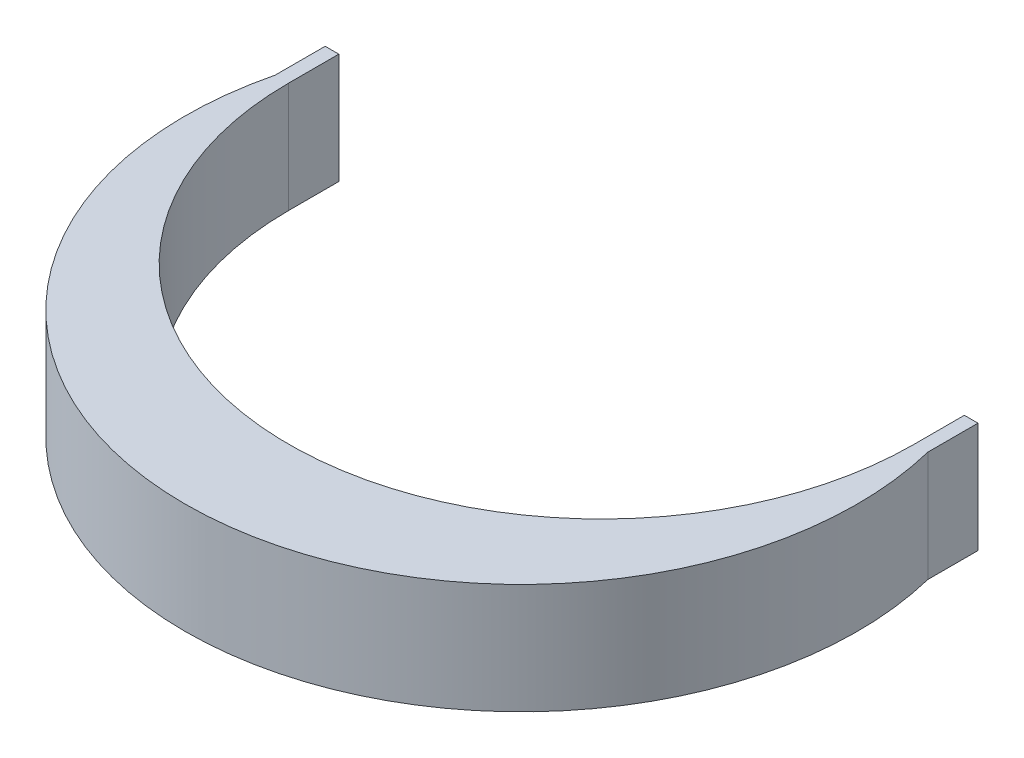
ISO-10303-21;
HEADER;
FILE_DESCRIPTION(('STEP AP214'),'2;1');
FILE_NAME('part.step','',(''),(''),'','','');
FILE_SCHEMA(('AUTOMOTIVE_DESIGN { 1 0 10303 214 1 1 1 1 }'));
ENDSEC;
DATA;
#1=APPLICATION_CONTEXT('core data for automotive mechanical design processes');
#2=APPLICATION_PROTOCOL_DEFINITION('international standard','automotive_design',2000,#1);
#3=PRODUCT_CONTEXT('',#1,'mechanical');
#4=PRODUCT('Part','Part','',(#3));
#5=PRODUCT_RELATED_PRODUCT_CATEGORY('part','',(#4));
#6=PRODUCT_DEFINITION_FORMATION('','',#4);
#7=PRODUCT_DEFINITION_CONTEXT('part definition',#1,'design');
#8=PRODUCT_DEFINITION('design','',#6,#7);
#9=PRODUCT_DEFINITION_SHAPE('','',#8);
#10=(LENGTH_UNIT() NAMED_UNIT(*) SI_UNIT(.MILLI.,.METRE.));
#11=(NAMED_UNIT(*) PLANE_ANGLE_UNIT() SI_UNIT($,.RADIAN.));
#12=(NAMED_UNIT(*) SI_UNIT($,.STERADIAN.) SOLID_ANGLE_UNIT());
#13=UNCERTAINTY_MEASURE_WITH_UNIT(LENGTH_MEASURE(1.E-05),#10,'distance_accuracy_value','');
#14=(GEOMETRIC_REPRESENTATION_CONTEXT(3) GLOBAL_UNCERTAINTY_ASSIGNED_CONTEXT((#13)) GLOBAL_UNIT_ASSIGNED_CONTEXT((#10,
#11,#12)) REPRESENTATION_CONTEXT('',''));
#15=CARTESIAN_POINT('',(0.,0.,0.));
#16=DIRECTION('',(0.,0.,1.));
#17=DIRECTION('',(1.,0.,0.));
#18=AXIS2_PLACEMENT_3D('',#15,#16,#17);
#19=CARTESIAN_POINT('',(0.,0.,1.25));
#20=DIRECTION('',(-1.,0.,0.));
#21=DIRECTION('',(0.,0.,1.));
#22=AXIS2_PLACEMENT_3D('',#19,#20,#21);
#23=PLANE('',#22);
#24=DIRECTION('',(0.,1.,0.));
#25=VECTOR('',#24,1.);
#26=CARTESIAN_POINT('',(0.,0.,0.));
#27=LINE('',#26,#25);
#28=CARTESIAN_POINT('',(0.,0.,0.));
#29=VERTEX_POINT('',#28);
#30=CARTESIAN_POINT('',(0.,2.75,0.));
#31=VERTEX_POINT('',#30);
#32=EDGE_CURVE('E168',#29,#31,#27,.T.);
#33=ORIENTED_EDGE('',*,*,#32,.T.);
#34=DIRECTION('',(0.,0.,-1.));
#35=VECTOR('',#34,1.);
#36=CARTESIAN_POINT('',(0.,2.75,1.25));
#37=LINE('',#36,#35);
#38=CARTESIAN_POINT('',(0.,2.75,1.25));
#39=VERTEX_POINT('',#38);
#40=EDGE_CURVE('E11',#39,#31,#37,.T.);
#41=ORIENTED_EDGE('',*,*,#40,.F.);
#42=DIRECTION('',(0.,1.,0.));
#43=VECTOR('',#42,1.);
#44=CARTESIAN_POINT('',(0.,0.,1.25));
#45=LINE('',#44,#43);
#46=CARTESIAN_POINT('',(0.,0.,1.25));
#47=VERTEX_POINT('',#46);
#48=EDGE_CURVE('E178',#47,#39,#45,.T.);
#49=ORIENTED_EDGE('',*,*,#48,.F.);
#50=DIRECTION('',(0.,0.,-1.));
#51=VECTOR('',#50,1.);
#52=CARTESIAN_POINT('',(0.,0.,1.25));
#53=LINE('',#52,#51);
#54=EDGE_CURVE('E185',#47,#29,#53,.T.);
#55=ORIENTED_EDGE('',*,*,#54,.T.);
#56=EDGE_LOOP('',(#33,#41,#49,#55));
#57=FACE_BOUND('',#56,.T.);
#58=ADVANCED_FACE('F51',(#57),#23,.F.);
#59=CARTESIAN_POINT('',(0.,2.75,1.25));
#60=DIRECTION('',(0.,-1.,0.));
#61=DIRECTION('',(0.,0.,-1.));
#62=AXIS2_PLACEMENT_3D('',#59,#60,#61);
#63=PLANE('',#62);
#64=DIRECTION('',(-1.,0.,0.));
#65=VECTOR('',#64,1.);
#66=CARTESIAN_POINT('',(0.,2.75,0.));
#67=LINE('',#66,#65);
#68=CARTESIAN_POINT('',(-0.34,2.75,0.));
#69=VERTEX_POINT('',#68);
#70=EDGE_CURVE('E188',#31,#69,#67,.T.);
#71=ORIENTED_EDGE('',*,*,#70,.T.);
#72=DIRECTION('',(0.,0.,-1.));
#73=VECTOR('',#72,1.);
#74=CARTESIAN_POINT('',(-0.34,2.75,1.25));
#75=LINE('',#74,#73);
#76=CARTESIAN_POINT('',(-0.34,2.75,1.25));
#77=VERTEX_POINT('',#76);
#78=EDGE_CURVE('E60',#77,#69,#75,.T.);
#79=ORIENTED_EDGE('',*,*,#78,.F.);
#80=CARTESIAN_POINT('',(7.795,2.75,3.25));
#81=DIRECTION('',(0.,1.,0.));
#82=DIRECTION('',(0.,0.,1.));
#83=AXIS2_PLACEMENT_3D('',#80,#81,#82);
#84=CIRCLE('',#83,8.37724443166427);
#85=CARTESIAN_POINT('',(15.929999955,2.75,1.25));
#86=VERTEX_POINT('',#85);
#87=EDGE_CURVE('E151',#77,#86,#84,.T.);
#88=ORIENTED_EDGE('',*,*,#87,.T.);
#89=DIRECTION('',(0.,0.,-1.));
#90=VECTOR('',#89,1.);
#91=CARTESIAN_POINT('',(15.929999955,2.75,1.25));
#92=LINE('',#91,#90);
#93=CARTESIAN_POINT('',(15.929999955,2.75,0.));
#94=VERTEX_POINT('',#93);
#95=EDGE_CURVE('E132',#86,#94,#92,.T.);
#96=ORIENTED_EDGE('',*,*,#95,.T.);
#97=DIRECTION('',(-1.,0.,0.));
#98=VECTOR('',#97,1.);
#99=CARTESIAN_POINT('',(15.59,2.75,0.));
#100=LINE('',#99,#98);
#101=CARTESIAN_POINT('',(15.59,2.75,0.));
#102=VERTEX_POINT('',#101);
#103=EDGE_CURVE('E125',#94,#102,#100,.T.);
#104=ORIENTED_EDGE('',*,*,#103,.T.);
#105=DIRECTION('',(0.,0.,-1.));
#106=VECTOR('',#105,1.);
#107=CARTESIAN_POINT('',(15.59,2.75,1.25));
#108=LINE('',#107,#106);
#109=CARTESIAN_POINT('',(15.59,2.75,1.25));
#110=VERTEX_POINT('',#109);
#111=EDGE_CURVE('E129',#110,#102,#108,.T.);
#112=ORIENTED_EDGE('',*,*,#111,.F.);
#113=CARTESIAN_POINT('',(7.795,2.75,1.25));
#114=DIRECTION('',(0.,-1.,0.));
#115=DIRECTION('',(0.,0.,1.));
#116=AXIS2_PLACEMENT_3D('',#113,#114,#115);
#117=CIRCLE('',#116,7.795);
#118=EDGE_CURVE('E157',#110,#39,#117,.T.);
#119=ORIENTED_EDGE('',*,*,#118,.T.);
#120=ORIENTED_EDGE('',*,*,#40,.T.);
#121=EDGE_LOOP('',(#71,#79,#88,#96,#104,#112,#119,#120));
#122=FACE_BOUND('',#121,.T.);
#123=ADVANCED_FACE('F127',(#122),#63,.F.);
#124=CARTESIAN_POINT('',(-0.34,0.,1.25));
#125=DIRECTION('',(1.,0.,0.));
#126=DIRECTION('',(0.,0.,-1.));
#127=AXIS2_PLACEMENT_3D('',#124,#125,#126);
#128=PLANE('',#127);
#129=DIRECTION('',(0.,-1.,0.));
#130=VECTOR('',#129,1.);
#131=CARTESIAN_POINT('',(-0.34,0.,0.));
#132=LINE('',#131,#130);
#133=CARTESIAN_POINT('',(-0.34,0.,0.));
#134=VERTEX_POINT('',#133);
#135=EDGE_CURVE('E84',#69,#134,#132,.T.);
#136=ORIENTED_EDGE('',*,*,#135,.T.);
#137=DIRECTION('',(0.,0.,-1.));
#138=VECTOR('',#137,1.);
#139=CARTESIAN_POINT('',(-0.34,0.,1.25));
#140=LINE('',#139,#138);
#141=CARTESIAN_POINT('',(-0.34,0.,1.25));
#142=VERTEX_POINT('',#141);
#143=EDGE_CURVE('E68',#142,#134,#140,.T.);
#144=ORIENTED_EDGE('',*,*,#143,.F.);
#145=DIRECTION('',(0.,-1.,0.));
#146=VECTOR('',#145,1.);
#147=CARTESIAN_POINT('',(-0.34,0.,1.25));
#148=LINE('',#147,#146);
#149=EDGE_CURVE('E181',#77,#142,#148,.T.);
#150=ORIENTED_EDGE('',*,*,#149,.F.);
#151=ORIENTED_EDGE('',*,*,#78,.T.);
#152=EDGE_LOOP('',(#136,#144,#150,#151));
#153=FACE_BOUND('',#152,.T.);
#154=ADVANCED_FACE('F201',(#153),#128,.F.);
#155=CARTESIAN_POINT('',(0.,0.,1.25));
#156=DIRECTION('',(0.,1.,0.));
#157=DIRECTION('',(-1.,0.,0.));
#158=AXIS2_PLACEMENT_3D('',#155,#156,#157);
#159=PLANE('',#158);
#160=DIRECTION('',(1.,0.,0.));
#161=VECTOR('',#160,1.);
#162=CARTESIAN_POINT('',(0.,0.,0.));
#163=LINE('',#162,#161);
#164=EDGE_CURVE('E89',#134,#29,#163,.T.);
#165=ORIENTED_EDGE('',*,*,#164,.T.);
#166=ORIENTED_EDGE('',*,*,#54,.F.);
#167=CARTESIAN_POINT('',(7.795,0.,1.25));
#168=DIRECTION('',(0.,1.,0.));
#169=DIRECTION('',(-1.,0.,0.));
#170=AXIS2_PLACEMENT_3D('',#167,#168,#169);
#171=CIRCLE('',#170,7.795);
#172=CARTESIAN_POINT('',(15.59,0.,1.25));
#173=VERTEX_POINT('',#172);
#174=EDGE_CURVE('E162',#47,#173,#171,.T.);
#175=ORIENTED_EDGE('',*,*,#174,.T.);
#176=DIRECTION('',(0.,0.,-1.));
#177=VECTOR('',#176,1.);
#178=CARTESIAN_POINT('',(15.59,0.,1.25));
#179=LINE('',#178,#177);
#180=CARTESIAN_POINT('',(15.59,0.,0.));
#181=VERTEX_POINT('',#180);
#182=EDGE_CURVE('E325',#173,#181,#179,.T.);
#183=ORIENTED_EDGE('',*,*,#182,.T.);
#184=DIRECTION('',(1.,0.,0.));
#185=VECTOR('',#184,1.);
#186=CARTESIAN_POINT('',(15.59,0.,0.));
#187=LINE('',#186,#185);
#188=CARTESIAN_POINT('',(15.929999955,0.,0.));
#189=VERTEX_POINT('',#188);
#190=EDGE_CURVE('E148',#181,#189,#187,.T.);
#191=ORIENTED_EDGE('',*,*,#190,.T.);
#192=DIRECTION('',(0.,0.,-1.));
#193=VECTOR('',#192,1.);
#194=CARTESIAN_POINT('',(15.929999955,0.,1.25));
#195=LINE('',#194,#193);
#196=CARTESIAN_POINT('',(15.929999955,0.,1.25));
#197=VERTEX_POINT('',#196);
#198=EDGE_CURVE('E316',#197,#189,#195,.T.);
#199=ORIENTED_EDGE('',*,*,#198,.F.);
#200=CARTESIAN_POINT('',(7.795,0.,3.25));
#201=DIRECTION('',(0.,1.,0.));
#202=DIRECTION('',(-1.,0.,0.));
#203=AXIS2_PLACEMENT_3D('',#200,#201,#202);
#204=CIRCLE('',#203,8.37724443166427);
#205=EDGE_CURVE('E166',#197,#142,#204,.F.);
#206=ORIENTED_EDGE('',*,*,#205,.T.);
#207=ORIENTED_EDGE('',*,*,#143,.T.);
#208=EDGE_LOOP('',(#165,#166,#175,#183,#191,#199,#206,#207));
#209=FACE_BOUND('',#208,.T.);
#210=ADVANCED_FACE('F207',(#209),#159,.F.);
#211=CARTESIAN_POINT('',(0.,0.,0.));
#212=DIRECTION('',(0.,0.,1.));
#213=DIRECTION('',(1.,0.,0.));
#214=AXIS2_PLACEMENT_3D('',#211,#212,#213);
#215=PLANE('',#214);
#216=ORIENTED_EDGE('',*,*,#32,.F.);
#217=ORIENTED_EDGE('',*,*,#164,.F.);
#218=ORIENTED_EDGE('',*,*,#135,.F.);
#219=ORIENTED_EDGE('',*,*,#70,.F.);
#220=EDGE_LOOP('',(#216,#217,#218,#219));
#221=FACE_BOUND('',#220,.T.);
#222=ADVANCED_FACE('F205',(#221),#215,.F.);
#223=CARTESIAN_POINT('',(7.795,-19.7078689630794,3.25));
#224=DIRECTION('',(0.,1.,0.));
#225=DIRECTION('',(0.,0.,1.));
#226=AXIS2_PLACEMENT_3D('',#223,#224,#225);
#227=CYLINDRICAL_SURFACE('',#226,8.37724443166427);
#228=ORIENTED_EDGE('',*,*,#205,.F.);
#229=DIRECTION('',(0.,1.,0.));
#230=VECTOR('',#229,1.);
#231=CARTESIAN_POINT('',(15.929999955,-19.7078689630794,1.25));
#232=LINE('',#231,#230);
#233=EDGE_CURVE('E172',#197,#86,#232,.T.);
#234=ORIENTED_EDGE('',*,*,#233,.T.);
#235=ORIENTED_EDGE('',*,*,#87,.F.);
#236=ORIENTED_EDGE('',*,*,#149,.T.);
#237=EDGE_LOOP('',(#228,#234,#235,#236));
#238=FACE_BOUND('',#237,.T.);
#239=ADVANCED_FACE('F211',(#238),#227,.T.);
#240=CARTESIAN_POINT('',(7.795,-19.7078689630794,1.25));
#241=DIRECTION('',(0.,1.,0.));
#242=DIRECTION('',(0.,0.,1.));
#243=AXIS2_PLACEMENT_3D('',#240,#241,#242);
#244=CYLINDRICAL_SURFACE('',#243,7.795);
#245=ORIENTED_EDGE('',*,*,#174,.F.);
#246=ORIENTED_EDGE('',*,*,#48,.T.);
#247=ORIENTED_EDGE('',*,*,#118,.F.);
#248=DIRECTION('',(0.,1.,0.));
#249=VECTOR('',#248,1.);
#250=CARTESIAN_POINT('',(15.59,-19.7078689630794,1.25));
#251=LINE('',#250,#249);
#252=EDGE_CURVE('E144',#173,#110,#251,.T.);
#253=ORIENTED_EDGE('',*,*,#252,.F.);
#254=EDGE_LOOP('',(#245,#246,#247,#253));
#255=FACE_BOUND('',#254,.T.);
#256=ADVANCED_FACE('F209',(#255),#244,.F.);
#257=CARTESIAN_POINT('',(15.59,2.75,1.25));
#258=DIRECTION('',(1.,0.,0.));
#259=DIRECTION('',(0.,0.,-1.));
#260=AXIS2_PLACEMENT_3D('',#257,#258,#259);
#261=PLANE('',#260);
#262=DIRECTION('',(0.,-1.,0.));
#263=VECTOR('',#262,1.);
#264=CARTESIAN_POINT('',(15.59,2.75,0.));
#265=LINE('',#264,#263);
#266=EDGE_CURVE('E142',#102,#181,#265,.T.);
#267=ORIENTED_EDGE('',*,*,#266,.T.);
#268=ORIENTED_EDGE('',*,*,#182,.F.);
#269=ORIENTED_EDGE('',*,*,#252,.T.);
#270=ORIENTED_EDGE('',*,*,#111,.T.);
#271=EDGE_LOOP('',(#267,#268,#269,#270));
#272=FACE_BOUND('',#271,.T.);
#273=ADVANCED_FACE('F141',(#272),#261,.F.);
#274=CARTESIAN_POINT('',(15.929999955,2.75,1.25));
#275=DIRECTION('',(-1.,0.,0.));
#276=DIRECTION('',(0.,0.,1.));
#277=AXIS2_PLACEMENT_3D('',#274,#275,#276);
#278=PLANE('',#277);
#279=DIRECTION('',(0.,1.,0.));
#280=VECTOR('',#279,1.);
#281=CARTESIAN_POINT('',(15.929999955,2.75,0.));
#282=LINE('',#281,#280);
#283=EDGE_CURVE('E137',#189,#94,#282,.T.);
#284=ORIENTED_EDGE('',*,*,#283,.T.);
#285=ORIENTED_EDGE('',*,*,#95,.F.);
#286=ORIENTED_EDGE('',*,*,#233,.F.);
#287=ORIENTED_EDGE('',*,*,#198,.T.);
#288=EDGE_LOOP('',(#284,#285,#286,#287));
#289=FACE_BOUND('',#288,.T.);
#290=ADVANCED_FACE('F216',(#289),#278,.F.);
#291=CARTESIAN_POINT('',(0.,0.,0.));
#292=DIRECTION('',(0.,0.,1.));
#293=DIRECTION('',(1.,0.,0.));
#294=AXIS2_PLACEMENT_3D('',#291,#292,#293);
#295=PLANE('',#294);
#296=ORIENTED_EDGE('',*,*,#266,.F.);
#297=ORIENTED_EDGE('',*,*,#103,.F.);
#298=ORIENTED_EDGE('',*,*,#283,.F.);
#299=ORIENTED_EDGE('',*,*,#190,.F.);
#300=EDGE_LOOP('',(#296,#297,#298,#299));
#301=FACE_BOUND('',#300,.T.);
#302=ADVANCED_FACE('F147',(#301),#295,.F.);
#303=CLOSED_SHELL('',(#58,#123,#154,#210,#222,#239,#256,#273,#290,#302));
#304=MANIFOLD_SOLID_BREP('B2',#303);
#305=ADVANCED_BREP_SHAPE_REPRESENTATION('',(#18,#304),#14);
#306=SHAPE_DEFINITION_REPRESENTATION(#9,#305);
ENDSEC;
END-ISO-10303-21;
